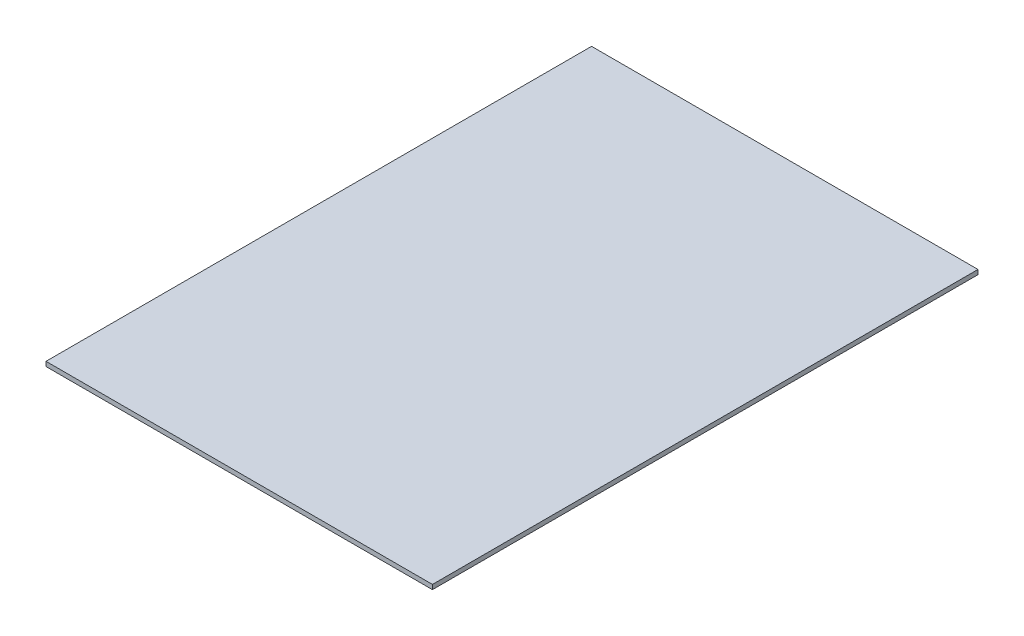
ISO-10303-21;
HEADER;
FILE_DESCRIPTION(('STEP AP214'),'2;1');
FILE_NAME('part.step','',(''),(''),'','','');
FILE_SCHEMA(('AUTOMOTIVE_DESIGN { 1 0 10303 214 1 1 1 1 }'));
ENDSEC;
DATA;
#1=APPLICATION_CONTEXT('core data for automotive mechanical design processes');
#2=APPLICATION_PROTOCOL_DEFINITION('international standard','automotive_design',2000,#1);
#3=PRODUCT_CONTEXT('',#1,'mechanical');
#4=PRODUCT('Part','Part','',(#3));
#5=PRODUCT_RELATED_PRODUCT_CATEGORY('part','',(#4));
#6=PRODUCT_DEFINITION_FORMATION('','',#4);
#7=PRODUCT_DEFINITION_CONTEXT('part definition',#1,'design');
#8=PRODUCT_DEFINITION('design','',#6,#7);
#9=PRODUCT_DEFINITION_SHAPE('','',#8);
#10=(LENGTH_UNIT() NAMED_UNIT(*) SI_UNIT(.MILLI.,.METRE.));
#11=(NAMED_UNIT(*) PLANE_ANGLE_UNIT() SI_UNIT($,.RADIAN.));
#12=(NAMED_UNIT(*) SI_UNIT($,.STERADIAN.) SOLID_ANGLE_UNIT());
#13=UNCERTAINTY_MEASURE_WITH_UNIT(LENGTH_MEASURE(1.E-05),#10,'distance_accuracy_value','');
#14=(GEOMETRIC_REPRESENTATION_CONTEXT(3) GLOBAL_UNCERTAINTY_ASSIGNED_CONTEXT((#13)) GLOBAL_UNIT_ASSIGNED_CONTEXT((#10,
#11,#12)) REPRESENTATION_CONTEXT('',''));
#15=CARTESIAN_POINT('',(0.,0.,0.));
#16=DIRECTION('',(0.,0.,1.));
#17=DIRECTION('',(1.,0.,0.));
#18=AXIS2_PLACEMENT_3D('',#15,#16,#17);
#19=CARTESIAN_POINT('',(42.5,1.,60.));
#20=DIRECTION('',(-1.,0.,0.));
#21=DIRECTION('',(0.,0.,1.));
#22=AXIS2_PLACEMENT_3D('',#19,#20,#21);
#23=PLANE('',#22);
#24=DIRECTION('',(0.,0.,-1.));
#25=VECTOR('',#24,1.);
#26=CARTESIAN_POINT('',(42.5,0.,60.));
#27=LINE('',#26,#25);
#28=CARTESIAN_POINT('',(42.5,0.,60.));
#29=VERTEX_POINT('',#28);
#30=CARTESIAN_POINT('',(42.5,0.,-60.));
#31=VERTEX_POINT('',#30);
#32=EDGE_CURVE('E98',#29,#31,#27,.T.);
#33=ORIENTED_EDGE('',*,*,#32,.T.);
#34=DIRECTION('',(0.,-1.,0.));
#35=VECTOR('',#34,1.);
#36=CARTESIAN_POINT('',(42.5,1.,-60.));
#37=LINE('',#36,#35);
#38=CARTESIAN_POINT('',(42.5,1.,-60.));
#39=VERTEX_POINT('',#38);
#40=EDGE_CURVE('E11',#39,#31,#37,.T.);
#41=ORIENTED_EDGE('',*,*,#40,.F.);
#42=DIRECTION('',(0.,0.,-1.));
#43=VECTOR('',#42,1.);
#44=CARTESIAN_POINT('',(42.5,1.,60.));
#45=LINE('',#44,#43);
#46=CARTESIAN_POINT('',(42.5,1.,60.));
#47=VERTEX_POINT('',#46);
#48=EDGE_CURVE('E86',#47,#39,#45,.T.);
#49=ORIENTED_EDGE('',*,*,#48,.F.);
#50=DIRECTION('',(0.,-1.,0.));
#51=VECTOR('',#50,1.);
#52=CARTESIAN_POINT('',(42.5,1.,60.));
#53=LINE('',#52,#51);
#54=EDGE_CURVE('E94',#47,#29,#53,.T.);
#55=ORIENTED_EDGE('',*,*,#54,.T.);
#56=EDGE_LOOP('',(#33,#41,#49,#55));
#57=FACE_BOUND('',#56,.T.);
#58=ADVANCED_FACE('F35',(#57),#23,.F.);
#59=CARTESIAN_POINT('',(-42.5,1.,-60.));
#60=DIRECTION('',(0.,0.,1.));
#61=DIRECTION('',(1.,0.,0.));
#62=AXIS2_PLACEMENT_3D('',#59,#60,#61);
#63=PLANE('',#62);
#64=DIRECTION('',(-1.,0.,0.));
#65=VECTOR('',#64,1.);
#66=CARTESIAN_POINT('',(-42.5,0.,-60.));
#67=LINE('',#66,#65);
#68=CARTESIAN_POINT('',(-42.5,0.,-60.));
#69=VERTEX_POINT('',#68);
#70=EDGE_CURVE('E90',#31,#69,#67,.T.);
#71=ORIENTED_EDGE('',*,*,#70,.T.);
#72=DIRECTION('',(0.,-1.,0.));
#73=VECTOR('',#72,1.);
#74=CARTESIAN_POINT('',(-42.5,1.,-60.));
#75=LINE('',#74,#73);
#76=CARTESIAN_POINT('',(-42.5,1.,-60.));
#77=VERTEX_POINT('',#76);
#78=EDGE_CURVE('E43',#77,#69,#75,.T.);
#79=ORIENTED_EDGE('',*,*,#78,.F.);
#80=DIRECTION('',(-1.,0.,0.));
#81=VECTOR('',#80,1.);
#82=CARTESIAN_POINT('',(-42.5,1.,-60.));
#83=LINE('',#82,#81);
#84=EDGE_CURVE('E81',#39,#77,#83,.T.);
#85=ORIENTED_EDGE('',*,*,#84,.F.);
#86=ORIENTED_EDGE('',*,*,#40,.T.);
#87=EDGE_LOOP('',(#71,#79,#85,#86));
#88=FACE_BOUND('',#87,.T.);
#89=ADVANCED_FACE('F89',(#88),#63,.F.);
#90=CARTESIAN_POINT('',(-42.5,1.,60.));
#91=DIRECTION('',(1.,0.,0.));
#92=DIRECTION('',(0.,0.,-1.));
#93=AXIS2_PLACEMENT_3D('',#90,#91,#92);
#94=PLANE('',#93);
#95=DIRECTION('',(0.,0.,1.));
#96=VECTOR('',#95,1.);
#97=CARTESIAN_POINT('',(-42.5,0.,60.));
#98=LINE('',#97,#96);
#99=CARTESIAN_POINT('',(-42.5,0.,60.));
#100=VERTEX_POINT('',#99);
#101=EDGE_CURVE('E68',#69,#100,#98,.T.);
#102=ORIENTED_EDGE('',*,*,#101,.T.);
#103=DIRECTION('',(0.,-1.,0.));
#104=VECTOR('',#103,1.);
#105=CARTESIAN_POINT('',(-42.5,1.,60.));
#106=LINE('',#105,#104);
#107=CARTESIAN_POINT('',(-42.5,1.,60.));
#108=VERTEX_POINT('',#107);
#109=EDGE_CURVE('E91',#108,#100,#106,.T.);
#110=ORIENTED_EDGE('',*,*,#109,.F.);
#111=DIRECTION('',(0.,0.,1.));
#112=VECTOR('',#111,1.);
#113=CARTESIAN_POINT('',(-42.5,1.,60.));
#114=LINE('',#113,#112);
#115=EDGE_CURVE('E84',#77,#108,#114,.T.);
#116=ORIENTED_EDGE('',*,*,#115,.F.);
#117=ORIENTED_EDGE('',*,*,#78,.T.);
#118=EDGE_LOOP('',(#102,#110,#116,#117));
#119=FACE_BOUND('',#118,.T.);
#120=ADVANCED_FACE('F92',(#119),#94,.F.);
#121=CARTESIAN_POINT('',(-42.5,1.,60.));
#122=DIRECTION('',(0.,0.,-1.));
#123=DIRECTION('',(-1.,0.,0.));
#124=AXIS2_PLACEMENT_3D('',#121,#122,#123);
#125=PLANE('',#124);
#126=DIRECTION('',(1.,0.,0.));
#127=VECTOR('',#126,1.);
#128=CARTESIAN_POINT('',(-42.5,0.,60.));
#129=LINE('',#128,#127);
#130=EDGE_CURVE('E74',#100,#29,#129,.T.);
#131=ORIENTED_EDGE('',*,*,#130,.T.);
#132=ORIENTED_EDGE('',*,*,#54,.F.);
#133=DIRECTION('',(1.,0.,0.));
#134=VECTOR('',#133,1.);
#135=CARTESIAN_POINT('',(-42.5,1.,60.));
#136=LINE('',#135,#134);
#137=EDGE_CURVE('E51',#108,#47,#136,.T.);
#138=ORIENTED_EDGE('',*,*,#137,.F.);
#139=ORIENTED_EDGE('',*,*,#109,.T.);
#140=EDGE_LOOP('',(#131,#132,#138,#139));
#141=FACE_BOUND('',#140,.T.);
#142=ADVANCED_FACE('F105',(#141),#125,.F.);
#143=CARTESIAN_POINT('',(0.,1.,0.));
#144=DIRECTION('',(0.,-1.,0.));
#145=DIRECTION('',(0.,0.,-1.));
#146=AXIS2_PLACEMENT_3D('',#143,#144,#145);
#147=PLANE('',#146);
#148=ORIENTED_EDGE('',*,*,#48,.T.);
#149=ORIENTED_EDGE('',*,*,#84,.T.);
#150=ORIENTED_EDGE('',*,*,#115,.T.);
#151=ORIENTED_EDGE('',*,*,#137,.T.);
#152=EDGE_LOOP('',(#148,#149,#150,#151));
#153=FACE_BOUND('',#152,.T.);
#154=ADVANCED_FACE('F82',(#153),#147,.F.);
#155=CARTESIAN_POINT('',(0.,0.,0.));
#156=DIRECTION('',(0.,-1.,0.));
#157=DIRECTION('',(0.,0.,-1.));
#158=AXIS2_PLACEMENT_3D('',#155,#156,#157);
#159=PLANE('',#158);
#160=ORIENTED_EDGE('',*,*,#32,.F.);
#161=ORIENTED_EDGE('',*,*,#130,.F.);
#162=ORIENTED_EDGE('',*,*,#101,.F.);
#163=ORIENTED_EDGE('',*,*,#70,.F.);
#164=EDGE_LOOP('',(#160,#161,#162,#163));
#165=FACE_BOUND('',#164,.T.);
#166=ADVANCED_FACE('F108',(#165),#159,.T.);
#167=CLOSED_SHELL('',(#58,#89,#120,#142,#154,#166));
#168=MANIFOLD_SOLID_BREP('B2',#167);
#169=ADVANCED_BREP_SHAPE_REPRESENTATION('',(#18,#168),#14);
#170=SHAPE_DEFINITION_REPRESENTATION(#9,#169);
ENDSEC;
END-ISO-10303-21;
